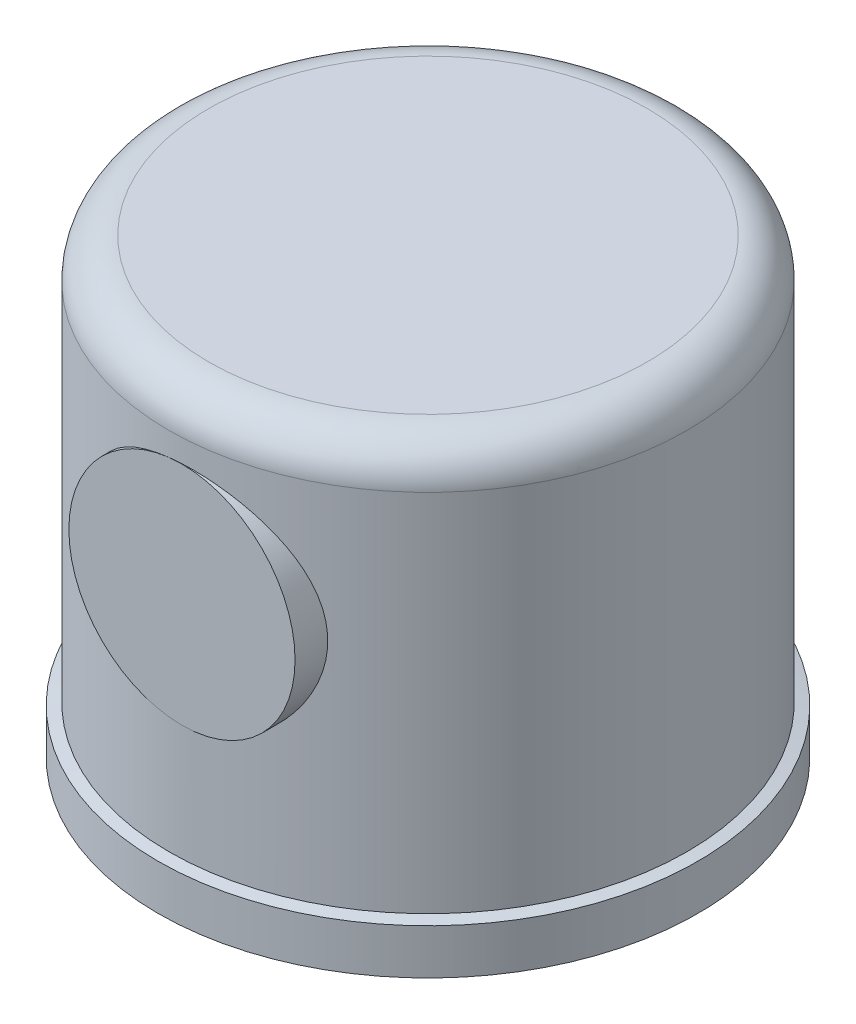
ISO-10303-21;
HEADER;
FILE_DESCRIPTION(('STEP AP214'),'2;1');
FILE_NAME('part.step','',(''),(''),'','','');
FILE_SCHEMA(('AUTOMOTIVE_DESIGN { 1 0 10303 214 1 1 1 1 }'));
ENDSEC;
DATA;
#1=APPLICATION_CONTEXT('core data for automotive mechanical design processes');
#2=APPLICATION_PROTOCOL_DEFINITION('international standard','automotive_design',2000,#1);
#3=PRODUCT_CONTEXT('',#1,'mechanical');
#4=PRODUCT('Part','Part','',(#3));
#5=PRODUCT_RELATED_PRODUCT_CATEGORY('part','',(#4));
#6=PRODUCT_DEFINITION_FORMATION('','',#4);
#7=PRODUCT_DEFINITION_CONTEXT('part definition',#1,'design');
#8=PRODUCT_DEFINITION('design','',#6,#7);
#9=PRODUCT_DEFINITION_SHAPE('','',#8);
#10=(LENGTH_UNIT() NAMED_UNIT(*) SI_UNIT(.MILLI.,.METRE.));
#11=(NAMED_UNIT(*) PLANE_ANGLE_UNIT() SI_UNIT($,.RADIAN.));
#12=(NAMED_UNIT(*) SI_UNIT($,.STERADIAN.) SOLID_ANGLE_UNIT());
#13=UNCERTAINTY_MEASURE_WITH_UNIT(LENGTH_MEASURE(1.E-05),#10,'distance_accuracy_value','');
#14=(GEOMETRIC_REPRESENTATION_CONTEXT(3) GLOBAL_UNCERTAINTY_ASSIGNED_CONTEXT((#13)) GLOBAL_UNIT_ASSIGNED_CONTEXT((#10,
#11,#12)) REPRESENTATION_CONTEXT('',''));
#15=CARTESIAN_POINT('',(0.,0.,0.));
#16=DIRECTION('',(0.,0.,1.));
#17=DIRECTION('',(1.,0.,0.));
#18=AXIS2_PLACEMENT_3D('',#15,#16,#17);
#19=CARTESIAN_POINT('',(0.,36.5,0.));
#20=DIRECTION('',(0.,-1.,0.));
#21=DIRECTION('',(0.,0.,-1.));
#22=AXIS2_PLACEMENT_3D('',#19,#20,#21);
#23=TOROIDAL_SURFACE('',#22,19.4,3.5);
#24=CARTESIAN_POINT('',(0.,40.,0.));
#25=DIRECTION('',(0.,-1.,0.));
#26=DIRECTION('',(0.,0.,-1.));
#27=AXIS2_PLACEMENT_3D('',#24,#25,#26);
#28=CIRCLE('',#27,19.4);
#29=CARTESIAN_POINT('',(0.,40.,-19.4));
#30=VERTEX_POINT('',#29);
#31=EDGE_CURVE('E53',#30,#30,#28,.T.);
#32=ORIENTED_EDGE('',*,*,#31,.T.);
#33=EDGE_LOOP('',(#32));
#34=FACE_BOUND('',#33,.T.);
#35=CARTESIAN_POINT('',(0.,36.5,0.));
#36=DIRECTION('',(0.,-1.,0.));
#37=DIRECTION('',(0.,0.,-1.));
#38=AXIS2_PLACEMENT_3D('',#35,#36,#37);
#39=CIRCLE('',#38,22.9);
#40=CARTESIAN_POINT('',(0.,36.5,-22.9));
#41=VERTEX_POINT('',#40);
#42=EDGE_CURVE('E67',#41,#41,#39,.T.);
#43=ORIENTED_EDGE('',*,*,#42,.F.);
#44=EDGE_LOOP('',(#43));
#45=FACE_BOUND('',#44,.T.);
#46=ADVANCED_FACE('F40',(#34,#45),#23,.T.);
#47=CARTESIAN_POINT('',(19.4,40.,0.));
#48=DIRECTION('',(0.,1.,0.));
#49=DIRECTION('',(0.,0.,1.));
#50=AXIS2_PLACEMENT_3D('',#47,#48,#49);
#51=PLANE('',#50);
#52=ORIENTED_EDGE('',*,*,#31,.F.);
#53=EDGE_LOOP('',(#52));
#54=FACE_BOUND('',#53,.T.);
#55=ADVANCED_FACE('F122',(#54),#51,.T.);
#56=CARTESIAN_POINT('',(20.9,11.9081781359912,0.));
#57=DIRECTION('',(0.,-1.,0.));
#58=DIRECTION('',(0.,0.,-1.));
#59=AXIS2_PLACEMENT_3D('',#56,#57,#58);
#60=PLANE('',#59);
#61=CARTESIAN_POINT('',(0.,11.9081781359912,0.));
#62=DIRECTION('',(0.,-1.,0.));
#63=DIRECTION('',(0.,0.,-1.));
#64=AXIS2_PLACEMENT_3D('',#61,#62,#63);
#65=CIRCLE('',#64,20.9);
#66=CARTESIAN_POINT('',(0.,11.9081781359912,-20.9));
#67=VERTEX_POINT('',#66);
#68=EDGE_CURVE('E145',#67,#67,#65,.T.);
#69=ORIENTED_EDGE('',*,*,#68,.T.);
#70=EDGE_LOOP('',(#69));
#71=FACE_BOUND('',#70,.T.);
#72=ADVANCED_FACE('F124',(#71),#60,.T.);
#73=CARTESIAN_POINT('',(0.,-0.724089275479442,0.));
#74=DIRECTION('',(0.,-1.,0.));
#75=DIRECTION('',(0.,0.,-1.));
#76=AXIS2_PLACEMENT_3D('',#73,#74,#75);
#77=CYLINDRICAL_SURFACE('',#76,20.9);
#78=CARTESIAN_POINT('',(0.,0.,0.));
#79=DIRECTION('',(0.,-1.,0.));
#80=DIRECTION('',(0.,0.,-1.));
#81=AXIS2_PLACEMENT_3D('',#78,#79,#80);
#82=CIRCLE('',#81,20.9);
#83=CARTESIAN_POINT('',(0.,0.,-20.9));
#84=VERTEX_POINT('',#83);
#85=EDGE_CURVE('E148',#84,#84,#82,.T.);
#86=ORIENTED_EDGE('',*,*,#85,.T.);
#87=EDGE_LOOP('',(#86));
#88=FACE_BOUND('',#87,.T.);
#89=ORIENTED_EDGE('',*,*,#68,.F.);
#90=EDGE_LOOP('',(#89));
#91=FACE_BOUND('',#90,.T.);
#92=ADVANCED_FACE('F130',(#88,#91),#77,.F.);
#93=CARTESIAN_POINT('',(20.9,0.,0.));
#94=DIRECTION('',(0.,-1.,0.));
#95=DIRECTION('',(0.,0.,-1.));
#96=AXIS2_PLACEMENT_3D('',#93,#94,#95);
#97=PLANE('',#96);
#98=CARTESIAN_POINT('',(0.,0.,0.));
#99=DIRECTION('',(0.,-1.,0.));
#100=DIRECTION('',(0.,0.,-1.));
#101=AXIS2_PLACEMENT_3D('',#98,#99,#100);
#102=CIRCLE('',#101,23.8715918375041);
#103=CARTESIAN_POINT('',(0.,0.,-23.8715918375041));
#104=VERTEX_POINT('',#103);
#105=EDGE_CURVE('E151',#104,#104,#102,.T.);
#106=ORIENTED_EDGE('',*,*,#105,.T.);
#107=EDGE_LOOP('',(#106));
#108=FACE_BOUND('',#107,.T.);
#109=ORIENTED_EDGE('',*,*,#85,.F.);
#110=EDGE_LOOP('',(#109));
#111=FACE_BOUND('',#110,.T.);
#112=ADVANCED_FACE('F173',(#108,#111),#97,.T.);
#113=CARTESIAN_POINT('',(0.,-0.724089275479442,0.));
#114=DIRECTION('',(0.,-1.,0.));
#115=DIRECTION('',(0.,0.,-1.));
#116=AXIS2_PLACEMENT_3D('',#113,#114,#115);
#117=CYLINDRICAL_SURFACE('',#116,23.8715918375041);
#118=CARTESIAN_POINT('',(0.,4.,0.));
#119=DIRECTION('',(0.,-1.,0.));
#120=DIRECTION('',(0.,0.,-1.));
#121=AXIS2_PLACEMENT_3D('',#118,#119,#120);
#122=CIRCLE('',#121,23.8715918375041);
#123=CARTESIAN_POINT('',(0.,4.,-23.8715918375041));
#124=VERTEX_POINT('',#123);
#125=EDGE_CURVE('E154',#124,#124,#122,.T.);
#126=ORIENTED_EDGE('',*,*,#125,.T.);
#127=EDGE_LOOP('',(#126));
#128=FACE_BOUND('',#127,.T.);
#129=ORIENTED_EDGE('',*,*,#105,.F.);
#130=EDGE_LOOP('',(#129));
#131=FACE_BOUND('',#130,.T.);
#132=ADVANCED_FACE('F169',(#128,#131),#117,.T.);
#133=CARTESIAN_POINT('',(0.,4.,0.));
#134=DIRECTION('',(0.,-1.,0.));
#135=DIRECTION('',(0.,0.,-1.));
#136=AXIS2_PLACEMENT_3D('',#133,#134,#135);
#137=CONICAL_SURFACE('',#136,23.8715918375041,1.33186665186768);
#138=CARTESIAN_POINT('',(0.,4.23666284308145,0.));
#139=DIRECTION('',(0.,-1.,0.));
#140=DIRECTION('',(0.,0.,-1.));
#141=AXIS2_PLACEMENT_3D('',#138,#139,#140);
#142=CIRCLE('',#141,22.9);
#143=CARTESIAN_POINT('',(0.,4.23666284308145,-22.9));
#144=VERTEX_POINT('',#143);
#145=EDGE_CURVE('E156',#144,#144,#142,.T.);
#146=ORIENTED_EDGE('',*,*,#145,.T.);
#147=EDGE_LOOP('',(#146));
#148=FACE_BOUND('',#147,.T.);
#149=ORIENTED_EDGE('',*,*,#125,.F.);
#150=EDGE_LOOP('',(#149));
#151=FACE_BOUND('',#150,.T.);
#152=ADVANCED_FACE('F165',(#148,#151),#137,.T.);
#153=CARTESIAN_POINT('',(0.,-0.724089275479442,0.));
#154=DIRECTION('',(0.,-1.,0.));
#155=DIRECTION('',(0.,0.,-1.));
#156=AXIS2_PLACEMENT_3D('',#153,#154,#155);
#157=CYLINDRICAL_SURFACE('',#156,22.9);
#158=CARTESIAN_POINT('',(11.1446298645785,24.5,20.0051799587393));
#159=CARTESIAN_POINT('',(11.1446277445211,24.7609901690464,20.0051824052752));
#160=CARTESIAN_POINT('',(11.1343963456302,25.0220630439062,20.0108915552293));
#161=CARTESIAN_POINT('',(11.0935934936793,25.54223924978,20.0335396146365));
#162=CARTESIAN_POINT('',(11.0630091209592,25.8013412239737,20.0504856570194));
#163=CARTESIAN_POINT('',(10.9818099909218,26.3160092112228,20.095073877167));
#164=CARTESIAN_POINT('',(10.9311536647032,26.5715667396853,20.1227382498763));
#165=CARTESIAN_POINT('',(10.8104070159934,27.0768725375808,20.1878625789932));
#166=CARTESIAN_POINT('',(10.7403082246235,27.326618223952,20.2253268036801));
#167=CARTESIAN_POINT('',(10.5819026423815,27.817222025643,20.3086505994999));
#168=CARTESIAN_POINT('',(10.493700069966,28.0581220970861,20.3544619561206));
#169=CARTESIAN_POINT('',(10.2996504177269,28.5312537147744,20.4533384685586));
#170=CARTESIAN_POINT('',(10.1937969504418,28.7634820855556,20.5064062490565));
#171=CARTESIAN_POINT('',(9.96537628941012,29.2179538313331,20.6183762342079));
#172=CARTESIAN_POINT('',(9.84281639879485,29.4402015132112,20.6772758864257));
#173=CARTESIAN_POINT('',(9.58179133663133,29.8738592149634,20.7995202088162));
#174=CARTESIAN_POINT('',(9.44332571992444,30.0852689312722,20.8628650033773));
#175=CARTESIAN_POINT('',(9.14016333292685,30.512078171252,20.9975468640248));
#176=CARTESIAN_POINT('',(8.97427161574757,30.7265534903059,21.0691250928046));
#177=CARTESIAN_POINT('',(8.62602631717368,31.1409291354725,21.2140809431241));
#178=CARTESIAN_POINT('',(8.44367688198169,31.3408331097395,21.2874581080826));
#179=CARTESIAN_POINT('',(8.06331262976379,31.7253021039391,21.4344250115112));
#180=CARTESIAN_POINT('',(7.86528878253018,31.9098581543593,21.5080148486363));
#181=CARTESIAN_POINT('',(7.45460216451242,32.262572437536,21.6537847126987));
#182=CARTESIAN_POINT('',(7.24193721877425,32.4307282250072,21.7259645281222));
#183=CARTESIAN_POINT('',(6.78673678556612,32.761447485421,21.8726202445706));
#184=CARTESIAN_POINT('',(6.54315547874084,32.922675406883,21.9468705518435));
#185=CARTESIAN_POINT('',(6.04177866022837,33.2237262116359,22.0901528799861));
#186=CARTESIAN_POINT('',(5.78398882520473,33.3635575602768,22.1591869591063));
#187=CARTESIAN_POINT('',(5.25570003325066,33.6206018607526,22.2903942528852));
#188=CARTESIAN_POINT('',(4.98520194493891,33.7378163556778,22.3525679354873));
#189=CARTESIAN_POINT('',(4.43333132777802,33.9483672767324,22.4685345832508));
#190=CARTESIAN_POINT('',(4.15195966145207,34.0417055923316,22.5223282114458));
#191=CARTESIAN_POINT('',(3.59490182219484,34.1992613183523,22.6177465632866));
#192=CARTESIAN_POINT('',(3.31964605817942,34.2647112622682,22.659848617038));
#193=CARTESIAN_POINT('',(2.76330401954821,34.3721905692311,22.7343990180205));
#194=CARTESIAN_POINT('',(2.48221790128177,34.4142205594778,22.7668476237657));
#195=CARTESIAN_POINT('',(1.91663353976729,34.4742088117513,22.8214195735881));
#196=CARTESIAN_POINT('',(1.63213707750828,34.4921791294193,22.8435480851559));
#197=CARTESIAN_POINT('',(1.06202715601996,34.5037217591204,22.8771417509054));
#198=CARTESIAN_POINT('',(0.776413770939054,34.497295664169,22.8886076012673));
#199=CARTESIAN_POINT('',(0.229859914063764,34.4615241292258,22.9003424755667));
#200=CARTESIAN_POINT('',(-0.0311902465202553,34.4340937120535,22.9014495986756));
#201=CARTESIAN_POINT('',(-0.550203549640618,34.3588178559456,22.8948600916812));
#202=CARTESIAN_POINT('',(-0.808166886708437,34.3109737105223,22.8871640193389));
#203=CARTESIAN_POINT('',(-1.31915931614173,34.195275767694,22.8634041002285));
#204=CARTESIAN_POINT('',(-1.57218850653733,34.1274223682594,22.8473404198816));
#205=CARTESIAN_POINT('',(-2.07159266475475,33.9722903435528,22.8074825320944));
#206=CARTESIAN_POINT('',(-2.31796748431996,33.8850112858849,22.7836881525709));
#207=CARTESIAN_POINT('',(-2.80147122594324,33.6921571891074,22.7292918446205));
#208=CARTESIAN_POINT('',(-3.03863406111506,33.5866590164344,22.69871836921));
#209=CARTESIAN_POINT('',(-3.5034549689152,33.3579022516768,22.6316364842074));
#210=CARTESIAN_POINT('',(-3.73110963730633,33.2346373676499,22.59512597147));
#211=CARTESIAN_POINT('',(-4.17557443367045,32.9712549377966,22.5172265167952));
#212=CARTESIAN_POINT('',(-4.39238429260554,32.8311369741725,22.4758374539161));
#213=CARTESIAN_POINT('',(-4.81404777841174,32.5349581629351,22.3893116991319));
#214=CARTESIAN_POINT('',(-5.01890044497264,32.3788960375695,22.3441747069251));
#215=CARTESIAN_POINT('',(-5.42868009092517,32.0409997279271,22.2482937186586));
#216=CARTESIAN_POINT('',(-5.63272624771951,31.8581456740842,22.1973761935752));
#217=CARTESIAN_POINT('',(-6.0249633729826,31.4765187389043,22.0941384871066));
#218=CARTESIAN_POINT('',(-6.21315376228662,31.2777452765946,22.0418182545765));
#219=CARTESIAN_POINT('',(-6.57270687150072,30.8653421101344,21.9372877834799));
#220=CARTESIAN_POINT('',(-6.74406268105014,30.6517063661788,21.8850775986203));
#221=CARTESIAN_POINT('',(-7.06884854585063,30.2108435494945,21.7823414164984));
#222=CARTESIAN_POINT('',(-7.2222790277907,29.9836168004767,21.7318153791676));
#223=CARTESIAN_POINT('',(-7.51668327700644,29.5063690902399,21.6317988300054));
#224=CARTESIAN_POINT('',(-7.65679319884188,29.2557832034913,21.5824556598315));
#225=CARTESIAN_POINT('',(-7.91523074458894,28.7428025511672,21.4890206360785));
#226=CARTESIAN_POINT('',(-8.03356719602266,28.480412625185,21.4449266569139));
#227=CARTESIAN_POINT('',(-8.24745626338107,27.9455272010351,21.3635803844406));
#228=CARTESIAN_POINT('',(-8.34301346320594,27.6730337487886,21.3263267149943));
#229=CARTESIAN_POINT('',(-8.51040644595413,27.1198771142381,21.2600823537505));
#230=CARTESIAN_POINT('',(-8.58224385269398,26.8392144926134,21.2310910963409));
#231=CARTESIAN_POINT('',(-8.6986004247129,26.2852507959685,21.1836755559937));
#232=CARTESIAN_POINT('',(-8.74424377652652,26.0122227122403,21.1648190795165));
#233=CARTESIAN_POINT('',(-8.81275694669258,25.4628421469245,21.1363833337898));
#234=CARTESIAN_POINT('',(-8.83562745226591,25.1864897659097,21.1268037845888));
#235=CARTESIAN_POINT('',(-8.85832653450985,24.632759640041,21.1172963042208));
#236=CARTESIAN_POINT('',(-8.85816220318086,24.3553822370727,21.1173654024136));
#237=CARTESIAN_POINT('',(-8.83481060673291,23.8017756929748,21.1271456394214));
#238=CARTESIAN_POINT('',(-8.81162408832163,23.5255465148953,21.1368564655142));
#239=CARTESIAN_POINT('',(-8.74457137350766,22.9928853495949,21.1646802481809));
#240=CARTESIAN_POINT('',(-8.70202518627721,22.7362575502454,21.1822558481562));
#241=CARTESIAN_POINT('',(-8.59722358411727,22.2276137636915,21.2250075862501));
#242=CARTESIAN_POINT('',(-8.5349613161298,21.9755994123303,21.2501863669959));
#243=CARTESIAN_POINT('',(-8.39131312244645,21.4779380529347,21.3073186542595));
#244=CARTESIAN_POINT('',(-8.30993121940881,21.2322897175823,21.339270735577));
#245=CARTESIAN_POINT('',(-8.12867521351164,20.7486626953314,21.4089715504602));
#246=CARTESIAN_POINT('',(-8.02879388275917,20.5106870490373,21.4467225487279));
#247=CARTESIAN_POINT('',(-7.80772737526773,20.036139872629,21.528207451263));
#248=CARTESIAN_POINT('',(-7.68595056948554,19.7998707896223,21.5720970566862));
#249=CARTESIAN_POINT('',(-7.42428278331998,19.3382003671058,21.6635462023525));
#250=CARTESIAN_POINT('',(-7.28438378818665,19.1128038970292,21.7111073626005));
#251=CARTESIAN_POINT('',(-6.98737224643551,18.6741342163592,21.8085086707196));
#252=CARTESIAN_POINT('',(-6.83025748640942,18.4608625700047,21.8583491111537));
#253=CARTESIAN_POINT('',(-6.49972381666145,18.0475678897984,21.9589031813285));
#254=CARTESIAN_POINT('',(-6.32630434634715,17.8475453118825,22.0096168410435));
#255=CARTESIAN_POINT('',(-5.95143636270874,17.4483371329927,22.1140418185163));
#256=CARTESIAN_POINT('',(-5.74887646243842,17.2501834664634,22.1677154363765));
#257=CARTESIAN_POINT('',(-5.32741765387536,16.8715783847214,22.2727583309144));
#258=CARTESIAN_POINT('',(-5.10852456000335,16.6911207223863,22.3241284172941));
#259=CARTESIAN_POINT('',(-4.65552124683866,16.3489975215538,22.4229766229538));
#260=CARTESIAN_POINT('',(-4.42140442220444,16.1873402262202,22.470453032352));
#261=CARTESIAN_POINT('',(-3.9395851404263,15.8842165481317,22.559912872869));
#262=CARTESIAN_POINT('',(-3.69188878303707,15.7427412011158,22.6018987420386));
#263=CARTESIAN_POINT('',(-3.18613177721801,15.4819676404776,22.6787023606292));
#264=CARTESIAN_POINT('',(-2.92815098391894,15.3625282367502,22.7135659110879));
#265=CARTESIAN_POINT('',(-2.40210717327647,15.1457723502827,22.7752057581696));
#266=CARTESIAN_POINT('',(-2.1340441207426,15.0484559447677,22.8019820265625));
#267=CARTESIAN_POINT('',(-1.59001516363166,14.8769537722367,22.8463627678783));
#268=CARTESIAN_POINT('',(-1.31405324665244,14.8027565511898,22.8639717854792));
#269=CARTESIAN_POINT('',(-0.75635805305185,14.6781945856537,22.8892073068402));
#270=CARTESIAN_POINT('',(-0.474625185120213,14.6278281595508,22.896834515031));
#271=CARTESIAN_POINT('',(0.0722859715553385,14.554106941895,22.9014025226651));
#272=CARTESIAN_POINT('',(0.337237494026199,14.5291037020605,22.8990561326617));
#273=CARTESIAN_POINT('',(0.868038682636657,14.500293411226,22.8850820522958));
#274=CARTESIAN_POINT('',(1.1338883022049,14.4964852775241,22.8734548360569));
#275=CARTESIAN_POINT('',(1.66445050559519,14.5099948098528,22.8409772386956));
#276=CARTESIAN_POINT('',(1.92916320718279,14.5273102321568,22.820127837296));
#277=CARTESIAN_POINT('',(2.45553149195771,14.5827638683679,22.7695031372511));
#278=CARTESIAN_POINT('',(2.71718706465624,14.6209021536953,22.7397278079911));
#279=CARTESIAN_POINT('',(3.22902866323948,14.7162720832564,22.6726335226335));
#280=CARTESIAN_POINT('',(3.47933734067708,14.7729957227044,22.6355247077284));
#281=CARTESIAN_POINT('',(3.97373691019839,14.9051249798455,22.5539838557736));
#282=CARTESIAN_POINT('',(4.21782796066531,14.9805301211341,22.5095520054813));
#283=CARTESIAN_POINT('',(4.69839188635823,15.1492976590485,22.4141725022691));
#284=CARTESIAN_POINT('',(4.93486492624146,15.2426596672465,22.3632249902986));
#285=CARTESIAN_POINT('',(5.39904694649486,15.4465901596045,22.2557201498885));
#286=CARTESIAN_POINT('',(5.62675252812734,15.557165234353,22.1991606757451));
#287=CARTESIAN_POINT('',(6.08560545212684,15.801818665363,22.0779311614545));
#288=CARTESIAN_POINT('',(6.31613816461629,15.9369097455035,22.0129780243647));
#289=CARTESIAN_POINT('',(6.76496023111327,16.2245565235295,21.879217919525));
#290=CARTESIAN_POINT('',(6.98324531893241,16.3771182513447,21.8104096253922));
#291=CARTESIAN_POINT('',(7.40653101115914,16.6987648815768,21.6703256166735));
#292=CARTESIAN_POINT('',(7.6115281085571,16.8678541166947,21.5990492582616));
#293=CARTESIAN_POINT('',(8.00724491883681,17.2216101708268,21.4554967168331));
#294=CARTESIAN_POINT('',(8.19796377286569,17.4062779254884,21.3832204739816));
#295=CARTESIAN_POINT('',(8.57923375090789,17.8060416905521,21.2332775364616));
#296=CARTESIAN_POINT('',(8.76849053680225,18.0223911031148,21.1556544384514));
#297=CARTESIAN_POINT('',(9.12802306312959,18.471065544664,21.0030315107857));
#298=CARTESIAN_POINT('',(9.29830510375407,18.7033852293607,20.9280308161226));
#299=CARTESIAN_POINT('',(9.6189117548438,19.1830626049239,20.7826261716822));
#300=CARTESIAN_POINT('',(9.76922099590453,19.4304316655885,20.712225782847));
#301=CARTESIAN_POINT('',(10.0485043140751,19.9387379246907,20.5781818627889));
#302=CARTESIAN_POINT('',(10.1774762944744,20.1996764532276,20.5145389958152));
#303=CARTESIAN_POINT('',(10.4114984860904,20.7305999218624,20.3967567454706));
#304=CARTESIAN_POINT('',(10.5167951107533,21.0004545626505,20.3425209552108));
#305=CARTESIAN_POINT('',(10.7039731792944,21.5498955506945,20.244656739209));
#306=CARTESIAN_POINT('',(10.7858674812725,21.8294764588866,20.2010224905704));
#307=CARTESIAN_POINT('',(10.9249942872062,22.3954450182329,20.1261207413414));
#308=CARTESIAN_POINT('',(10.9822988899582,22.6818101357439,20.0948171089339));
#309=CARTESIAN_POINT('',(11.0716772994762,23.259434657659,20.0457127114312));
#310=CARTESIAN_POINT('',(11.1037721616721,23.5506897697581,20.0279006784607));
#311=CARTESIAN_POINT('',(11.1302189113319,23.952242346709,20.0132022938853));
#312=CARTESIAN_POINT('',(11.1356208480716,24.0616949617612,20.0101964875757));
#313=CARTESIAN_POINT('',(11.142826827679,24.2807601837541,20.0061847740899));
#314=CARTESIAN_POINT('',(11.1446307550947,24.3903727957158,20.005178931088));
#315=CARTESIAN_POINT('',(11.1446298645785,24.5,20.0051799587393));
#316=B_SPLINE_CURVE_WITH_KNOTS('',3,(#158,#159,#160,#161,#162,#163,#164,#165,#166,#167,#168,
#169,#170,#171,#172,#173,#174,#175,#176,#177,#178,#179,#180,#181,#182,#183,#184,#185,#186,#187,
#188,#189,#190,#191,#192,#193,#194,#195,#196,#197,#198,#199,#200,#201,#202,#203,#204,#205,#206,
#207,#208,#209,#210,#211,#212,#213,#214,#215,#216,#217,#218,#219,#220,#221,#222,#223,#224,#225,
#226,#227,#228,#229,#230,#231,#232,#233,#234,#235,#236,#237,#238,#239,#240,#241,#242,#243,#244,
#245,#246,#247,#248,#249,#250,#251,#252,#253,#254,#255,#256,#257,#258,#259,#260,#261,#262,#263,
#264,#265,#266,#267,#268,#269,#270,#271,#272,#273,#274,#275,#276,#277,#278,#279,#280,#281,#282,
#283,#284,#285,#286,#287,#288,#289,#290,#291,#292,#293,#294,#295,#296,#297,#298,#299,#300,#301,
#302,#303,#304,#305,#306,#307,#308,#309,#310,#311,#312,#313,#314,#315),.UNSPECIFIED.,.T.,.F.,(4,
2,2,2,2,2,2,2,2,2,2,2,2,2,2,2,2,2,2,2,2,2,2,2,2,2,2,2,2,2,2,2,2,2,2,2,2,2,2,2,2,2,2,2,2,2,2,2,2,
2,2,2,2,2,2,2,2,2,2,2,2,2,2,2,2,2,2,2,2,2,2,2,2,2,2,2,2,2,4),(0.,0.782853371863684,
1.56620415799369,2.35118581021928,3.13650992843717,3.91743394254665,4.69864117122472,
5.47950798765304,6.26039666377767,7.10080814363015,7.94100848599341,8.78169645057313,
9.62250957102901,10.5255676615734,11.4282675368108,12.330905801344,13.233472612417,
14.09046145755,14.947427350927,15.8039636813221,16.66044408332,17.4469636557941,18.233433397995,
19.0198874989038,19.8063591072549,20.5895902257896,21.3730994041688,22.156628010204,
22.9402194569236,23.7753354768278,24.6104819878612,25.4459698949615,26.2814379103108,
27.1542661039175,28.0267396471375,28.8990374728176,29.7712755700911,30.6025643580955,
31.433828059366,32.2648358304736,33.0958166493363,33.8770889238547,34.6586330572751,
35.4400129054504,36.221698692257,37.0290406910539,37.8367409731751,38.6445452223779,
39.4523772558618,40.3165677421142,41.180452041317,42.0447137003992,42.9085902751392,
43.7667234088129,44.6248595379374,45.4825698387297,46.3402196063944,47.1376434645909,
47.9350265878987,48.732325021207,49.5296261891886,50.3067355053317,51.0838250061329,
51.8608976994786,52.6382686557873,53.4623272643386,54.2866711558217,55.1112317323597,
55.9358418673873,56.8280225705364,57.7199061543321,58.6124721312862,59.5051257644001,
60.3880076269421,61.2704034647948,62.1501940752412,63.0292490920329,63.3580709520086,
63.6869033629588),.UNSPECIFIED.);
#317=CARTESIAN_POINT('',(0.,34.4342751357668,22.9000000000001));
#318=VERTEX_POINT('',#317);
#319=CARTESIAN_POINT('',(0.,14.5657248642331,22.9000000000001));
#320=VERTEX_POINT('',#319);
#321=EDGE_CURVE('E61',#318,#320,#316,.T.);
#322=ORIENTED_EDGE('',*,*,#321,.F.);
#323=EDGE_CURVE('E59',#320,#318,#316,.T.);
#324=ORIENTED_EDGE('',*,*,#323,.F.);
#325=EDGE_LOOP('',(#322,#324));
#326=FACE_BOUND('',#325,.T.);
#327=ORIENTED_EDGE('',*,*,#42,.T.);
#328=EDGE_LOOP('',(#327));
#329=FACE_BOUND('',#328,.T.);
#330=ORIENTED_EDGE('',*,*,#145,.F.);
#331=EDGE_LOOP('',(#330));
#332=FACE_BOUND('',#331,.T.);
#333=ADVANCED_FACE('F62',(#326,#329,#332),#157,.T.);
#334=CARTESIAN_POINT('',(1.14462986457853,24.5,22.9000000000001));
#335=DIRECTION('',(0.,0.,1.));
#336=DIRECTION('',(1.,0.,0.));
#337=AXIS2_PLACEMENT_3D('',#334,#335,#336);
#338=PLANE('',#337);
#339=CARTESIAN_POINT('',(1.14462986457853,24.5,22.9000000000001));
#340=DIRECTION('',(0.,0.,1.));
#341=DIRECTION('',(1.,0.,0.));
#342=AXIS2_PLACEMENT_3D('',#339,#340,#341);
#343=CIRCLE('',#342,10.);
#344=EDGE_CURVE('E72',#320,#318,#343,.T.);
#345=ORIENTED_EDGE('',*,*,#344,.T.);
#346=EDGE_CURVE('E77',#318,#320,#343,.T.);
#347=ORIENTED_EDGE('',*,*,#346,.T.);
#348=EDGE_LOOP('',(#345,#347));
#349=FACE_BOUND('',#348,.T.);
#350=ADVANCED_FACE('F76',(#349),#338,.T.);
#351=CARTESIAN_POINT('',(1.14462986457853,24.5,16.9000000000001));
#352=DIRECTION('',(0.,0.,1.));
#353=DIRECTION('',(1.,0.,0.));
#354=AXIS2_PLACEMENT_3D('',#351,#352,#353);
#355=CYLINDRICAL_SURFACE('',#354,10.);
#356=ORIENTED_EDGE('',*,*,#346,.F.);
#357=ORIENTED_EDGE('',*,*,#321,.T.);
#358=EDGE_LOOP('',(#356,#357));
#359=FACE_BOUND('',#358,.T.);
#360=ADVANCED_FACE('F79',(#359),#355,.T.);
#361=ORIENTED_EDGE('',*,*,#344,.F.);
#362=ORIENTED_EDGE('',*,*,#323,.T.);
#363=EDGE_LOOP('',(#361,#362));
#364=FACE_BOUND('',#363,.T.);
#365=ADVANCED_FACE('F71',(#364),#355,.T.);
#366=CLOSED_SHELL('',(#46,#55,#72,#92,#112,#132,#152,#333,#350,#360,#365));
#367=CARTESIAN_POINT('',(18.9,38.,0.));
#368=DIRECTION('',(0.,-1.,0.));
#369=DIRECTION('',(0.,0.,-1.));
#370=AXIS2_PLACEMENT_3D('',#367,#368,#369);
#371=PLANE('',#370);
#372=CARTESIAN_POINT('',(0.,38.,0.));
#373=DIRECTION('',(0.,-1.,0.));
#374=DIRECTION('',(0.,0.,-1.));
#375=AXIS2_PLACEMENT_3D('',#372,#373,#374);
#376=CIRCLE('',#375,18.9);
#377=CARTESIAN_POINT('',(0.,38.,-18.9));
#378=VERTEX_POINT('',#377);
#379=EDGE_CURVE('E136',#378,#378,#376,.T.);
#380=ORIENTED_EDGE('',*,*,#379,.T.);
#381=EDGE_LOOP('',(#380));
#382=FACE_BOUND('',#381,.T.);
#383=ADVANCED_FACE('F110',(#382),#371,.T.);
#384=CARTESIAN_POINT('',(0.,36.,0.));
#385=DIRECTION('',(0.,-1.,0.));
#386=DIRECTION('',(0.,0.,-1.));
#387=AXIS2_PLACEMENT_3D('',#384,#385,#386);
#388=TOROIDAL_SURFACE('',#387,18.9,2.);
#389=CARTESIAN_POINT('',(0.,36.,0.));
#390=DIRECTION('',(0.,-1.,0.));
#391=DIRECTION('',(0.,0.,-1.));
#392=AXIS2_PLACEMENT_3D('',#389,#390,#391);
#393=CIRCLE('',#392,20.9);
#394=CARTESIAN_POINT('',(0.,36.,-20.9));
#395=VERTEX_POINT('',#394);
#396=EDGE_CURVE('E137',#395,#395,#393,.T.);
#397=ORIENTED_EDGE('',*,*,#396,.T.);
#398=EDGE_LOOP('',(#397));
#399=FACE_BOUND('',#398,.T.);
#400=ORIENTED_EDGE('',*,*,#379,.F.);
#401=EDGE_LOOP('',(#400));
#402=FACE_BOUND('',#401,.T.);
#403=ADVANCED_FACE('F112',(#399,#402),#388,.F.);
#404=CARTESIAN_POINT('',(0.,-0.724089275479442,0.));
#405=DIRECTION('',(0.,-1.,0.));
#406=DIRECTION('',(0.,0.,-1.));
#407=AXIS2_PLACEMENT_3D('',#404,#405,#406);
#408=CYLINDRICAL_SURFACE('',#407,20.9);
#409=CARTESIAN_POINT('',(11.1446298645785,24.5,17.6807020556748));
#410=CARTESIAN_POINT('',(11.1446279091429,24.2430416195614,17.6807046012758));
#411=CARTESIAN_POINT('',(11.1347102540173,23.9860363196105,17.6869666825429));
#412=CARTESIAN_POINT('',(11.0951769841968,23.4740368662757,17.711791959631));
#413=CARTESIAN_POINT('',(11.0655506369154,23.2190438853204,17.7303618577895));
#414=CARTESIAN_POINT('',(10.9869561232709,22.712720954057,17.7791713069156));
#415=CARTESIAN_POINT('',(10.9379529347466,22.4613984955785,17.8094319857888));
#416=CARTESIAN_POINT('',(10.8212398191909,21.9645761400012,17.8805880578735));
#417=CARTESIAN_POINT('',(10.75352156098,21.7190788890185,17.9214881868531));
#418=CARTESIAN_POINT('',(10.6006852371521,21.2370981632122,18.0123100051586));
#419=CARTESIAN_POINT('',(10.5156821446994,21.000566786143,18.0621718419379));
#420=CARTESIAN_POINT('',(10.3288243885498,20.536001291917,18.1696725409938));
#421=CARTESIAN_POINT('',(10.2269635401265,20.307970331129,18.2273142560934));
#422=CARTESIAN_POINT('',(10.0072932167038,19.8615663922329,18.348837174927));
#423=CARTESIAN_POINT('',(9.88948871362381,19.6431904313326,18.4127164318035));
#424=CARTESIAN_POINT('',(9.6387146482511,19.2168479105328,18.5452228162005));
#425=CARTESIAN_POINT('',(9.5057446482219,19.0088816513482,18.6138500807447));
#426=CARTESIAN_POINT('',(9.21246913719604,18.5854187726459,18.7608563376559));
#427=CARTESIAN_POINT('',(9.05077385735853,18.3709934680642,18.8395512638532));
#428=CARTESIAN_POINT('',(8.7110971331717,17.9562680451089,18.998999698316));
#429=CARTESIAN_POINT('',(8.53311465493874,17.7559688248661,19.0797533370301));
#430=CARTESIAN_POINT('',(8.16159015605921,17.3702014217364,19.2416092608204));
#431=CARTESIAN_POINT('',(7.96803684795298,17.1847441958133,19.3227117577342));
#432=CARTESIAN_POINT('',(7.56640728714962,16.829759814457,19.4834867860091));
#433=CARTESIAN_POINT('',(7.35833576404402,16.6602275130062,19.563159772526));
#434=CARTESIAN_POINT('',(6.90855062114976,16.3229975976939,19.7267422204671));
#435=CARTESIAN_POINT('',(6.66550644965115,16.1569272481059,19.8103596396676));
#436=CARTESIAN_POINT('',(6.16433253336525,15.8461262910426,19.9719886026049));
#437=CARTESIAN_POINT('',(5.90620170167332,15.7013972237332,20.0499997415374));
#438=CARTESIAN_POINT('',(5.37645783304004,15.4347073447709,20.198498290586));
#439=CARTESIAN_POINT('',(5.10484934139268,15.312738922349,20.2689882122797));
#440=CARTESIAN_POINT('',(4.54988478757333,15.0929128268936,20.4007315913442));
#441=CARTESIAN_POINT('',(4.26652986730713,14.9950528165999,20.4619859438607));
#442=CARTESIAN_POINT('',(3.70705328924623,14.8297346688796,20.5704678529385));
#443=CARTESIAN_POINT('',(3.43147625770881,14.7608343430173,20.6183058353274));
#444=CARTESIAN_POINT('',(2.87387195897784,14.6465386442152,20.7033904496491));
#445=CARTESIAN_POINT('',(2.59184488893616,14.6011425538451,20.740637404841));
#446=CARTESIAN_POINT('',(2.02385475410009,14.5346263408936,20.8037402760952));
#447=CARTESIAN_POINT('',(1.73789426166488,14.5134910511661,20.8296033028154));
#448=CARTESIAN_POINT('',(1.16440072316068,14.4959064622009,20.8695175970932));
#449=CARTESIAN_POINT('',(0.876867810035494,14.4994551072876,20.8835698481419));
#450=CARTESIAN_POINT('',(0.330930936852656,14.5297856049638,20.8989863324679));
#451=CARTESIAN_POINT('',(0.0724267321390121,14.5542627553172,20.9014564449279));
#452=CARTESIAN_POINT('',(-0.441796994474041,14.6232326963174,20.8969115329168));
#453=CARTESIAN_POINT('',(-0.697516728479499,14.6677239513169,20.889897236085));
#454=CARTESIAN_POINT('',(-1.20431899309289,14.776337847613,20.8668150497608));
#455=CARTESIAN_POINT('',(-1.45540165122598,14.8404599481827,20.8507474096303));
#456=CARTESIAN_POINT('',(-1.95121360132696,14.9877637075943,20.8102052021575));
#457=CARTESIAN_POINT('',(-2.19594274106809,15.0709458226351,20.7857304335847));
#458=CARTESIAN_POINT('',(-2.67540385964988,15.2548548169503,20.729447350241));
#459=CARTESIAN_POINT('',(-2.91020345452832,15.3554255077104,20.6977035673108));
#460=CARTESIAN_POINT('',(-3.37071792000166,15.5738247607182,20.6277126641047));
#461=CARTESIAN_POINT('',(-3.59642956164059,15.6916593890667,20.5894632571575));
#462=CARTESIAN_POINT('',(-4.03748237695515,15.9437022889081,20.507536493875));
#463=CARTESIAN_POINT('',(-4.25282331604549,16.0779109305388,20.4638590148365));
#464=CARTESIAN_POINT('',(-4.67208429326401,16.3618218341117,20.372228263065));
#465=CARTESIAN_POINT('',(-4.87600352537031,16.5115251873873,20.3242746891884));
#466=CARTESIAN_POINT('',(-5.28634561171029,16.8373471740138,20.2215869294342));
#467=CARTESIAN_POINT('',(-5.49180457531716,17.0146055181217,20.1666140055175));
#468=CARTESIAN_POINT('',(-5.88737465257279,17.384922692303,20.0547022347687));
#469=CARTESIAN_POINT('',(-6.07748514509139,17.5779821611888,19.9977633085083));
#470=CARTESIAN_POINT('',(-6.44146339426939,17.9789167124662,19.8835095845199));
#471=CARTESIAN_POINT('',(-6.61532366393618,18.186798546993,19.82619462643));
#472=CARTESIAN_POINT('',(-6.94577987046139,18.6162352558116,19.7128553233762));
#473=CARTESIAN_POINT('',(-7.10237347204007,18.837791973297,19.6568311537973));
#474=CARTESIAN_POINT('',(-7.40601498426782,19.3068283042302,19.5445304390357));
#475=CARTESIAN_POINT('',(-7.55196054982998,19.5550661665437,19.48843267404));
#476=CARTESIAN_POINT('',(-7.82224871984756,20.0640030190874,19.3815260258919));
#477=CARTESIAN_POINT('',(-7.94660008309485,20.3246969020807,19.3307150017604));
#478=CARTESIAN_POINT('',(-8.1726403600522,20.8569195427546,19.2362409000247));
#479=CARTESIAN_POINT('',(-8.27433499599231,21.12844554418,19.1925760183171));
#480=CARTESIAN_POINT('',(-8.45404102406455,21.6804696951827,19.1141001065524));
#481=CARTESIAN_POINT('',(-8.53205433200985,21.9609671169441,19.0792883603161));
#482=CARTESIAN_POINT('',(-8.6601997402689,22.5145626049831,19.0214519557537));
#483=CARTESIAN_POINT('',(-8.71152925963457,22.7873310469167,18.9979256375778));
#484=CARTESIAN_POINT('',(-8.79137650356131,23.3368759973624,18.9611087264943));
#485=CARTESIAN_POINT('',(-8.81989497264973,23.6136523747598,18.9478177995155));
#486=CARTESIAN_POINT('',(-8.85375082882029,24.1688079799249,18.932021747164));
#487=CARTESIAN_POINT('',(-8.85909821510427,24.44718646438,18.9295119693202));
#488=CARTESIAN_POINT('',(-8.84656802665163,25.0032970742355,18.9353712730681));
#489=CARTESIAN_POINT('',(-8.8286915597932,25.2810292298353,18.9437398357159));
#490=CARTESIAN_POINT('',(-8.77222707663324,25.8121175908427,18.9699473148045));
#491=CARTESIAN_POINT('',(-8.73534902700931,26.065696827364,18.9870031839175));
#492=CARTESIAN_POINT('',(-8.64240063235686,26.5686864377694,19.0294908258553));
#493=CARTESIAN_POINT('',(-8.5863237061957,26.8180953513307,19.0549254707054));
#494=CARTESIAN_POINT('',(-8.45553768354077,27.3110133710801,19.1133199746498));
#495=CARTESIAN_POINT('',(-8.38083209549481,27.554523578743,19.1462784166436));
#496=CARTESIAN_POINT('',(-8.21340578687101,28.0343699528198,19.2186960927477));
#497=CARTESIAN_POINT('',(-8.12067797541487,28.2707032530086,19.2581578846812));
#498=CARTESIAN_POINT('',(-7.91458744257154,28.7425263322095,19.3437886432258));
#499=CARTESIAN_POINT('',(-7.80064369061639,28.9777297065286,19.3901362720063));
#500=CARTESIAN_POINT('',(-7.5550833575314,29.437919057496,19.4871276083371));
#501=CARTESIAN_POINT('',(-7.42345905002596,29.6629005093318,19.5377731905032));
#502=CARTESIAN_POINT('',(-7.14337768872811,30.1014857651557,19.6419060760835));
#503=CARTESIAN_POINT('',(-6.99491783943234,30.3150876709158,19.6953938506514));
#504=CARTESIAN_POINT('',(-6.68200446211572,30.7298710821492,19.8037428026959));
#505=CARTESIAN_POINT('',(-6.5175501944289,30.9310520125071,19.8586040436016));
#506=CARTESIAN_POINT('',(-6.15848574453727,31.3369710294209,19.9730210565627));
#507=CARTESIAN_POINT('',(-5.96249665452715,31.5404938437902,20.0325696984982));
#508=CARTESIAN_POINT('',(-5.55376853719182,31.9304246366215,20.1497104265007));
#509=CARTESIAN_POINT('',(-5.34103522197295,32.1168384050412,20.2073031702854));
#510=CARTESIAN_POINT('',(-4.89981829870072,32.4714989650002,20.3187985320932));
#511=CARTESIAN_POINT('',(-4.67132650063269,32.6397361914493,20.3726992018186));
#512=CARTESIAN_POINT('',(-4.2001157965001,32.9566107048243,20.4750364954157));
#513=CARTESIAN_POINT('',(-3.95740330175594,33.1052567275942,20.5234755532534));
#514=CARTESIAN_POINT('',(-3.45891452777884,33.3819318491734,20.6133477306577));
#515=CARTESIAN_POINT('',(-3.20312534147726,33.5099400393991,20.6547737472772));
#516=CARTESIAN_POINT('',(-2.68045607062268,33.7439545499651,20.7290814352351));
#517=CARTESIAN_POINT('',(-2.41357586359017,33.8499606272558,20.7619630121872));
#518=CARTESIAN_POINT('',(-1.87091178436445,34.0388150201296,20.8178778440802));
#519=CARTESIAN_POINT('',(-1.59513342588957,34.1216773805227,20.8409170763824));
#520=CARTESIAN_POINT('',(-1.03680594593341,34.2634148145675,20.8761405277794));
#521=CARTESIAN_POINT('',(-0.754257435276788,34.3222920436699,20.8883257224012));
#522=CARTESIAN_POINT('',(-0.208136710865089,34.4116203613972,20.9006002424078));
#523=CARTESIAN_POINT('',(0.0551015415057397,34.443999720891,20.9015958498858));
#524=CARTESIAN_POINT('',(0.583158286675202,34.4877387714805,20.8935309520948));
#525=CARTESIAN_POINT('',(0.847976685319654,34.4990997026718,20.8844710401558));
#526=CARTESIAN_POINT('',(1.37709700428843,34.5007973009931,20.8562650227775));
#527=CARTESIAN_POINT('',(1.64139899718885,34.4911371727007,20.8371204550412));
#528=CARTESIAN_POINT('',(2.16751303724601,34.4510456785098,20.788979399665));
#529=CARTESIAN_POINT('',(2.42932509262287,34.4206143812084,20.7599829445611));
#530=CARTESIAN_POINT('',(2.93866335898046,34.3410031777209,20.6939046631949));
#531=CARTESIAN_POINT('',(3.18635412831771,34.2925805870793,20.6571724041344));
#532=CARTESIAN_POINT('',(3.67610496839552,34.1775464680933,20.5756622685614));
#533=CARTESIAN_POINT('',(3.91816523885736,34.1109355859827,20.5308846779206));
#534=CARTESIAN_POINT('',(4.39526228613837,33.9602311947679,20.434062811275));
#535=CARTESIAN_POINT('',(4.63029938356961,33.8761384851186,20.3820188676008));
#536=CARTESIAN_POINT('',(5.092234092691,33.6912103136511,20.2715460784072));
#537=CARTESIAN_POINT('',(5.31912854160137,33.5903684298851,20.2131147868078));
#538=CARTESIAN_POINT('',(5.77739397050603,33.3660331171361,20.0871009816842));
#539=CARTESIAN_POINT('',(6.00817374390596,33.2415244041843,20.0191759802578));
#540=CARTESIAN_POINT('',(6.4582621430533,32.9754754932274,19.8785429556874));
#541=CARTESIAN_POINT('',(6.67756679031269,32.833929443689,19.8058332931435));
#542=CARTESIAN_POINT('',(7.10375540015218,32.5347143728201,19.6569993310884));
#543=CARTESIAN_POINT('',(7.31063570702505,32.3770406426532,19.5808740379704));
#544=CARTESIAN_POINT('',(7.71107919388715,32.0464669123876,19.4266647390194));
#545=CARTESIAN_POINT('',(7.90464152283831,31.8735659408528,19.3485806084481));
#546=CARTESIAN_POINT('',(8.29656732934895,31.4950930375005,19.1840192266102));
#547=CARTESIAN_POINT('',(8.49343084108479,31.2879857967001,19.0974930371915));
#548=CARTESIAN_POINT('',(8.86895251570466,30.8573914938457,18.9260213212994));
#549=CARTESIAN_POINT('',(9.04761616115715,30.6339093996753,18.8410753251454));
#550=CARTESIAN_POINT('',(9.38590206062907,30.1712978323407,18.6748600358276));
#551=CARTESIAN_POINT('',(9.545505371028,29.9321531519616,18.5935944495082));
#552=CARTESIAN_POINT('',(9.84431229702477,29.4394869390908,18.4371356379174));
#553=CARTESIAN_POINT('',(9.9835132557547,29.185963540102,18.3619432040852));
#554=CARTESIAN_POINT('',(10.2415051001894,28.6632494587883,18.2193175033698));
#555=CARTESIAN_POINT('',(10.3600775235498,28.3939272543659,18.1519695237355));
#556=CARTESIAN_POINT('',(10.5736381034555,27.8437701924383,18.0284056824395));
#557=CARTESIAN_POINT('',(10.6686398947249,27.562942100722,17.9721833888149));
#558=CARTESIAN_POINT('',(10.8335232013297,26.9926267305744,17.8732763260297));
#559=CARTESIAN_POINT('',(10.9034812820679,26.7031688272161,17.8305503429313));
#560=CARTESIAN_POINT('',(11.0174419947496,26.1175361513616,17.760363142642));
#561=CARTESIAN_POINT('',(11.0614661477993,25.8213671605941,17.7328892696776));
#562=CARTESIAN_POINT('',(11.1095920772399,25.3536356282384,17.7027494851221));
#563=CARTESIAN_POINT('',(11.1227211438815,25.1833006871329,17.6944956491643));
#564=CARTESIAN_POINT('',(11.1402410724924,24.8419841275141,17.6834708462863));
#565=CARTESIAN_POINT('',(11.1446311658954,24.6710024534474,17.6807003616106));
#566=CARTESIAN_POINT('',(11.1446298645785,24.5,17.6807020556748));
#567=B_SPLINE_CURVE_WITH_KNOTS('',3,(#409,#410,#411,#412,#413,#414,#415,#416,#417,#418,#419,
#420,#421,#422,#423,#424,#425,#426,#427,#428,#429,#430,#431,#432,#433,#434,#435,#436,#437,#438,
#439,#440,#441,#442,#443,#444,#445,#446,#447,#448,#449,#450,#451,#452,#453,#454,#455,#456,#457,
#458,#459,#460,#461,#462,#463,#464,#465,#466,#467,#468,#469,#470,#471,#472,#473,#474,#475,#476,
#477,#478,#479,#480,#481,#482,#483,#484,#485,#486,#487,#488,#489,#490,#491,#492,#493,#494,#495,
#496,#497,#498,#499,#500,#501,#502,#503,#504,#505,#506,#507,#508,#509,#510,#511,#512,#513,#514,
#515,#516,#517,#518,#519,#520,#521,#522,#523,#524,#525,#526,#527,#528,#529,#530,#531,#532,#533,
#534,#535,#536,#537,#538,#539,#540,#541,#542,#543,#544,#545,#546,#547,#548,#549,#550,#551,#552,
#553,#554,#555,#556,#557,#558,#559,#560,#561,#562,#563,#564,#565,#566),.UNSPECIFIED.,.T.,.F.,(4,
2,2,2,2,2,2,2,2,2,2,2,2,2,2,2,2,2,2,2,2,2,2,2,2,2,2,2,2,2,2,2,2,2,2,2,2,2,2,2,2,2,2,2,2,2,2,2,2,
2,2,2,2,2,2,2,2,2,2,2,2,2,2,2,2,2,2,2,2,2,2,2,2,2,2,2,2,2,4),(0.,0.770691847061993,
1.54180372682815,2.31431575017263,3.0871722195688,3.85504684558348,4.62320381435778,
5.3911217882374,6.159061932894,6.99774947356456,7.83649028967274,8.67584469355845,
9.51492692663984,10.4318008727076,11.3487409557398,12.2653738781796,13.1819178999731,
14.0449127279585,14.9078812128075,15.7703099005488,16.6326667661711,17.4107373061706,
18.1887481563604,18.9667375783591,19.7447456233792,20.5160975995082,21.2877212616806,
22.0593623697898,22.8310578636424,23.6607572229379,24.4904901421384,25.3206034803758,
26.1508289523042,27.0298611547216,27.908535977173,28.7869886274786,29.6653701922461,
30.4999030004653,31.3344085693489,32.1685539815137,33.0026596027973,33.7722125851883,
34.5420296251882,35.311701790279,36.0816773996503,36.8771184142208,37.6729081730667,
38.4688302650107,39.2647891820928,40.1300472841694,40.9950114818354,41.8604286574021,
42.7254586227873,43.5913595330189,44.457270008043,45.3226538561853,46.187959918474,
46.9826231864542,47.7772395674944,48.5717348208904,49.3662274504752,50.1304944456975,
50.8947342898863,51.6589391925998,52.4234377850988,53.2352242745468,54.0472903747877,
54.8595942563543,55.6719499971995,56.5665984500817,57.4609765950799,58.3562363715298,
59.2516126285539,60.1559596904108,61.0597823953922,61.9608177833891,62.861104395685,
63.3739446753281,63.8868300557332),.UNSPECIFIED.);
#568=CARTESIAN_POINT('',(11.1446298645785,24.5,17.6807020556748));
#569=VERTEX_POINT('',#568);
#570=EDGE_CURVE('E11',#569,#569,#567,.T.);
#571=ORIENTED_EDGE('',*,*,#570,.F.);
#572=EDGE_LOOP('',(#571));
#573=FACE_BOUND('',#572,.T.);
#574=CARTESIAN_POINT('',(0.,13.9081781359912,0.));
#575=DIRECTION('',(0.,-1.,0.));
#576=DIRECTION('',(0.,0.,-1.));
#577=AXIS2_PLACEMENT_3D('',#574,#575,#576);
#578=CIRCLE('',#577,20.9);
#579=CARTESIAN_POINT('',(0.,13.9081781359912,-20.9));
#580=VERTEX_POINT('',#579);
#581=EDGE_CURVE('E142',#580,#580,#578,.T.);
#582=ORIENTED_EDGE('',*,*,#581,.T.);
#583=EDGE_LOOP('',(#582));
#584=FACE_BOUND('',#583,.T.);
#585=ORIENTED_EDGE('',*,*,#396,.F.);
#586=EDGE_LOOP('',(#585));
#587=FACE_BOUND('',#586,.T.);
#588=ADVANCED_FACE('F106',(#573,#584,#587),#408,.F.);
#589=CARTESIAN_POINT('',(20.9,13.9081781359912,0.));
#590=DIRECTION('',(0.,1.,0.));
#591=DIRECTION('',(0.,0.,1.));
#592=AXIS2_PLACEMENT_3D('',#589,#590,#591);
#593=PLANE('',#592);
#594=ORIENTED_EDGE('',*,*,#581,.F.);
#595=EDGE_LOOP('',(#594));
#596=FACE_BOUND('',#595,.T.);
#597=ADVANCED_FACE('F101',(#596),#593,.T.);
#598=CARTESIAN_POINT('',(1.14462986457853,24.5,16.9000000000001));
#599=DIRECTION('',(0.,0.,1.));
#600=DIRECTION('',(1.,0.,0.));
#601=AXIS2_PLACEMENT_3D('',#598,#599,#600);
#602=PLANE('',#601);
#603=CARTESIAN_POINT('',(1.14462986457853,24.5,16.9000000000001));
#604=DIRECTION('',(0.,0.,1.));
#605=DIRECTION('',(1.,0.,0.));
#606=AXIS2_PLACEMENT_3D('',#603,#604,#605);
#607=CIRCLE('',#606,10.);
#608=CARTESIAN_POINT('',(11.1446298645785,24.5,16.9000000000001));
#609=VERTEX_POINT('',#608);
#610=EDGE_CURVE('E74',#609,#609,#607,.T.);
#611=ORIENTED_EDGE('',*,*,#610,.F.);
#612=EDGE_LOOP('',(#611));
#613=FACE_BOUND('',#612,.T.);
#614=ADVANCED_FACE('F94',(#613),#602,.F.);
#615=ORIENTED_EDGE('',*,*,#570,.T.);
#616=EDGE_LOOP('',(#615));
#617=FACE_BOUND('',#616,.T.);
#618=ORIENTED_EDGE('',*,*,#610,.T.);
#619=EDGE_LOOP('',(#618));
#620=FACE_BOUND('',#619,.T.);
#621=ADVANCED_FACE('F90',(#617,#620),#355,.T.);
#622=CLOSED_SHELL('',(#383,#403,#588,#597,#614,#621));
#623=ORIENTED_CLOSED_SHELL('',*,#622,.T.);
#624=BREP_WITH_VOIDS('B2',#366,(#623));
#625=ADVANCED_BREP_SHAPE_REPRESENTATION('',(#18,#624),#14);
#626=SHAPE_DEFINITION_REPRESENTATION(#9,#625);
ENDSEC;
END-ISO-10303-21;
